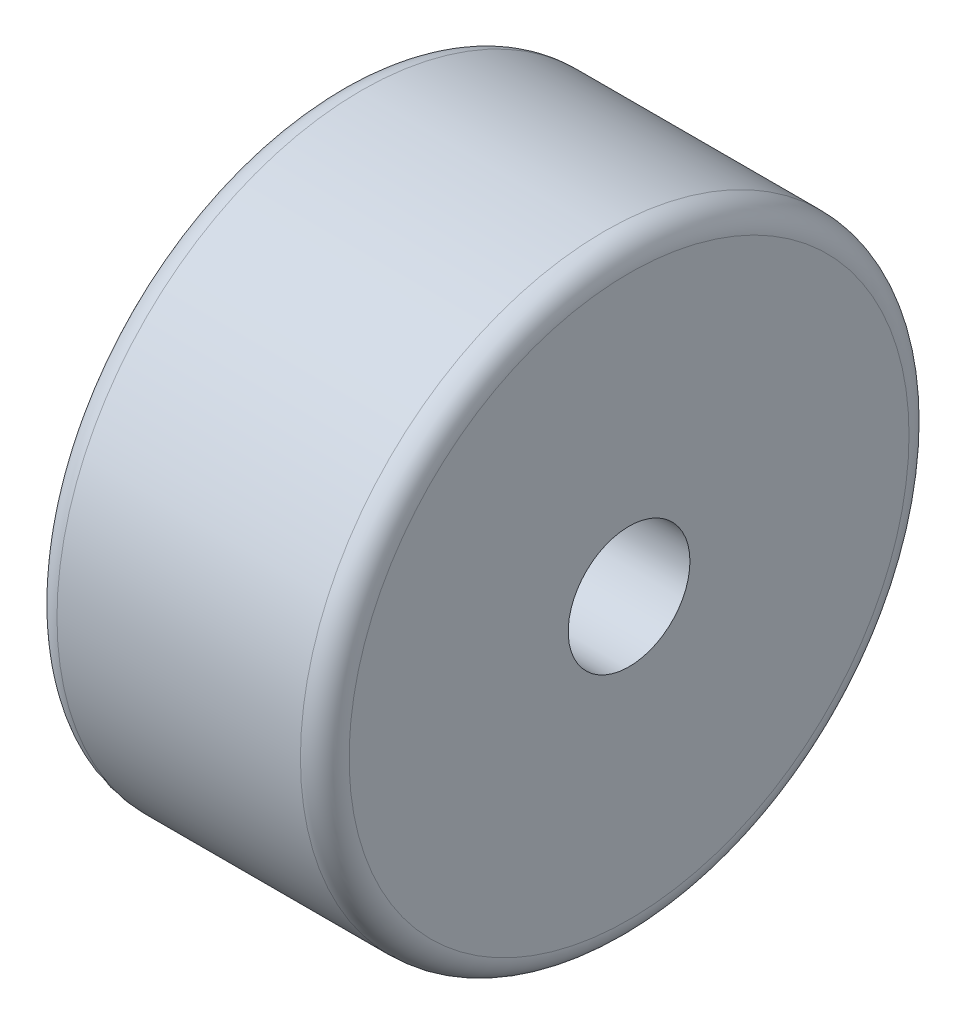
ISO-10303-21;
HEADER;
FILE_DESCRIPTION(('STEP AP214'),'2;1');
FILE_NAME('part.step','',(''),(''),'','','');
FILE_SCHEMA(('AUTOMOTIVE_DESIGN { 1 0 10303 214 1 1 1 1 }'));
ENDSEC;
DATA;
#1=APPLICATION_CONTEXT('core data for automotive mechanical design processes');
#2=APPLICATION_PROTOCOL_DEFINITION('international standard','automotive_design',2000,#1);
#3=PRODUCT_CONTEXT('',#1,'mechanical');
#4=PRODUCT('Part','Part','',(#3));
#5=PRODUCT_RELATED_PRODUCT_CATEGORY('part','',(#4));
#6=PRODUCT_DEFINITION_FORMATION('','',#4);
#7=PRODUCT_DEFINITION_CONTEXT('part definition',#1,'design');
#8=PRODUCT_DEFINITION('design','',#6,#7);
#9=PRODUCT_DEFINITION_SHAPE('','',#8);
#10=(LENGTH_UNIT() NAMED_UNIT(*) SI_UNIT(.MILLI.,.METRE.));
#11=(NAMED_UNIT(*) PLANE_ANGLE_UNIT() SI_UNIT($,.RADIAN.));
#12=(NAMED_UNIT(*) SI_UNIT($,.STERADIAN.) SOLID_ANGLE_UNIT());
#13=UNCERTAINTY_MEASURE_WITH_UNIT(LENGTH_MEASURE(1.E-05),#10,'distance_accuracy_value','');
#14=(GEOMETRIC_REPRESENTATION_CONTEXT(3) GLOBAL_UNCERTAINTY_ASSIGNED_CONTEXT((#13)) GLOBAL_UNIT_ASSIGNED_CONTEXT((#10,
#11,#12)) REPRESENTATION_CONTEXT('',''));
#15=CARTESIAN_POINT('',(0.,0.,0.));
#16=DIRECTION('',(0.,0.,1.));
#17=DIRECTION('',(1.,0.,0.));
#18=AXIS2_PLACEMENT_3D('',#15,#16,#17);
#19=CARTESIAN_POINT('',(12.,0.,0.));
#20=DIRECTION('',(-1.,0.,0.));
#21=DIRECTION('',(0.,0.,1.));
#22=AXIS2_PLACEMENT_3D('',#19,#20,#21);
#23=CYLINDRICAL_SURFACE('',#22,12.5);
#24=CARTESIAN_POINT('',(11.,0.,0.));
#25=DIRECTION('',(1.,0.,0.));
#26=DIRECTION('',(0.,0.,-1.));
#27=AXIS2_PLACEMENT_3D('',#24,#25,#26);
#28=CIRCLE('',#27,12.5);
#29=CARTESIAN_POINT('',(11.,0.,-12.5));
#30=VERTEX_POINT('',#29);
#31=EDGE_CURVE('E45',#30,#30,#28,.F.);
#32=ORIENTED_EDGE('',*,*,#31,.T.);
#33=EDGE_LOOP('',(#32));
#34=FACE_BOUND('',#33,.T.);
#35=CARTESIAN_POINT('',(1.,0.,0.));
#36=DIRECTION('',(1.,0.,0.));
#37=DIRECTION('',(0.,0.,-1.));
#38=AXIS2_PLACEMENT_3D('',#35,#36,#37);
#39=CIRCLE('',#38,12.5);
#40=CARTESIAN_POINT('',(1.,0.,-12.5));
#41=VERTEX_POINT('',#40);
#42=EDGE_CURVE('E50',#41,#41,#39,.T.);
#43=ORIENTED_EDGE('',*,*,#42,.T.);
#44=EDGE_LOOP('',(#43));
#45=FACE_BOUND('',#44,.T.);
#46=ADVANCED_FACE('F37',(#34,#45),#23,.T.);
#47=CARTESIAN_POINT('',(12.,0.,0.));
#48=DIRECTION('',(1.,0.,0.));
#49=DIRECTION('',(0.,0.,-1.));
#50=AXIS2_PLACEMENT_3D('',#47,#48,#49);
#51=PLANE('',#50);
#52=CARTESIAN_POINT('',(12.,0.,0.));
#53=DIRECTION('',(1.,0.,0.));
#54=DIRECTION('',(0.,0.,-1.));
#55=AXIS2_PLACEMENT_3D('',#52,#53,#54);
#56=CIRCLE('',#55,11.5);
#57=CARTESIAN_POINT('',(12.,0.,-11.5));
#58=VERTEX_POINT('',#57);
#59=EDGE_CURVE('E55',#58,#58,#56,.T.);
#60=ORIENTED_EDGE('',*,*,#59,.T.);
#61=EDGE_LOOP('',(#60));
#62=FACE_BOUND('',#61,.T.);
#63=CARTESIAN_POINT('',(12.,0.,0.));
#64=DIRECTION('',(1.,0.,0.));
#65=DIRECTION('',(0.,0.,-1.));
#66=AXIS2_PLACEMENT_3D('',#63,#64,#65);
#67=CIRCLE('',#66,2.5);
#68=CARTESIAN_POINT('',(12.,0.,-2.5));
#69=VERTEX_POINT('',#68);
#70=EDGE_CURVE('E62',#69,#69,#67,.T.);
#71=ORIENTED_EDGE('',*,*,#70,.F.);
#72=EDGE_LOOP('',(#71));
#73=FACE_BOUND('',#72,.T.);
#74=ADVANCED_FACE('F79',(#62,#73),#51,.T.);
#75=CARTESIAN_POINT('',(0.,0.,0.));
#76=DIRECTION('',(1.,0.,0.));
#77=DIRECTION('',(0.,0.,-1.));
#78=AXIS2_PLACEMENT_3D('',#75,#76,#77);
#79=PLANE('',#78);
#80=CARTESIAN_POINT('',(0.,0.,0.));
#81=DIRECTION('',(1.,0.,0.));
#82=DIRECTION('',(0.,0.,-1.));
#83=AXIS2_PLACEMENT_3D('',#80,#81,#82);
#84=CIRCLE('',#83,11.5);
#85=CARTESIAN_POINT('',(0.,0.,-11.5));
#86=VERTEX_POINT('',#85);
#87=EDGE_CURVE('E10',#86,#86,#84,.F.);
#88=ORIENTED_EDGE('',*,*,#87,.T.);
#89=EDGE_LOOP('',(#88));
#90=FACE_BOUND('',#89,.T.);
#91=CARTESIAN_POINT('',(0.,0.,0.));
#92=DIRECTION('',(1.,0.,0.));
#93=DIRECTION('',(0.,0.,-1.));
#94=AXIS2_PLACEMENT_3D('',#91,#92,#93);
#95=CIRCLE('',#94,2.5);
#96=CARTESIAN_POINT('',(0.,0.,-2.5));
#97=VERTEX_POINT('',#96);
#98=EDGE_CURVE('E61',#97,#97,#95,.T.);
#99=ORIENTED_EDGE('',*,*,#98,.T.);
#100=EDGE_LOOP('',(#99));
#101=FACE_BOUND('',#100,.T.);
#102=ADVANCED_FACE('F70',(#90,#101),#79,.F.);
#103=CARTESIAN_POINT('',(0.,0.,0.));
#104=DIRECTION('',(1.,0.,0.));
#105=DIRECTION('',(0.,0.,-1.));
#106=AXIS2_PLACEMENT_3D('',#103,#104,#105);
#107=CYLINDRICAL_SURFACE('',#106,2.5);
#108=ORIENTED_EDGE('',*,*,#98,.F.);
#109=EDGE_LOOP('',(#108));
#110=FACE_BOUND('',#109,.T.);
#111=ORIENTED_EDGE('',*,*,#70,.T.);
#112=EDGE_LOOP('',(#111));
#113=FACE_BOUND('',#112,.T.);
#114=ADVANCED_FACE('F72',(#110,#113),#107,.F.);
#115=CARTESIAN_POINT('',(11.,0.,0.));
#116=DIRECTION('',(1.,0.,0.));
#117=DIRECTION('',(0.,0.,-1.));
#118=AXIS2_PLACEMENT_3D('',#115,#116,#117);
#119=TOROIDAL_SURFACE('',#118,11.5,1.);
#120=ORIENTED_EDGE('',*,*,#31,.F.);
#121=EDGE_LOOP('',(#120));
#122=FACE_BOUND('',#121,.T.);
#123=ORIENTED_EDGE('',*,*,#59,.F.);
#124=EDGE_LOOP('',(#123));
#125=FACE_BOUND('',#124,.T.);
#126=ADVANCED_FACE('F75',(#122,#125),#119,.T.);
#127=CARTESIAN_POINT('',(1.,0.,0.));
#128=DIRECTION('',(1.,0.,0.));
#129=DIRECTION('',(0.,0.,-1.));
#130=AXIS2_PLACEMENT_3D('',#127,#128,#129);
#131=TOROIDAL_SURFACE('',#130,11.5,1.);
#132=ORIENTED_EDGE('',*,*,#87,.F.);
#133=EDGE_LOOP('',(#132));
#134=FACE_BOUND('',#133,.T.);
#135=ORIENTED_EDGE('',*,*,#42,.F.);
#136=EDGE_LOOP('',(#135));
#137=FACE_BOUND('',#136,.T.);
#138=ADVANCED_FACE('F39',(#134,#137),#131,.T.);
#139=CLOSED_SHELL('',(#46,#74,#102,#114,#126,#138));
#140=MANIFOLD_SOLID_BREP('B2',#139);
#141=ADVANCED_BREP_SHAPE_REPRESENTATION('',(#18,#140),#14);
#142=SHAPE_DEFINITION_REPRESENTATION(#9,#141);
ENDSEC;
END-ISO-10303-21;
